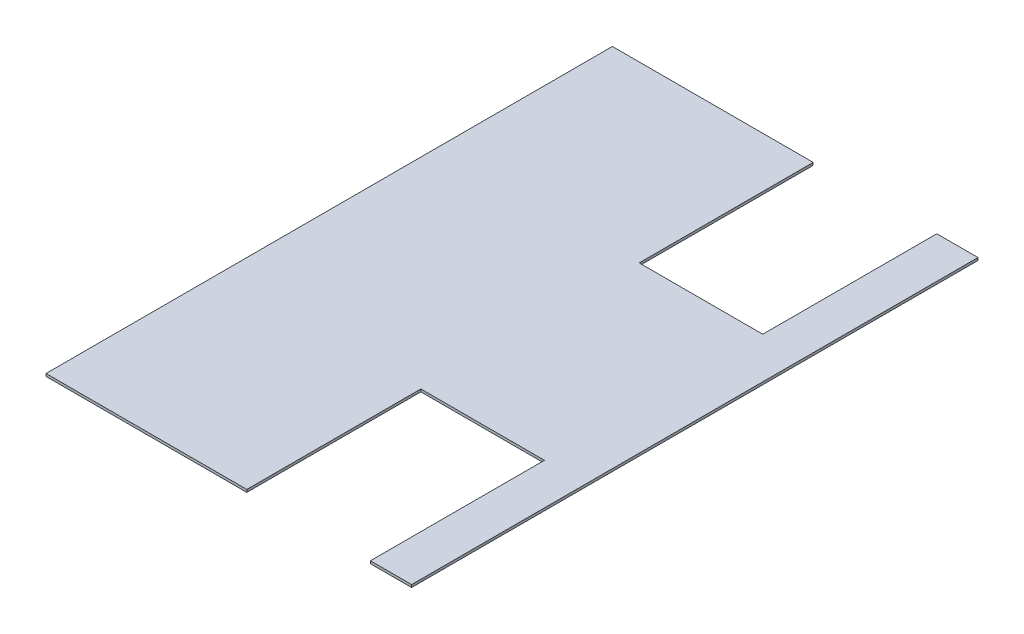
ISO-10303-21;
HEADER;
FILE_DESCRIPTION(('STEP AP214'),'2;1');
FILE_NAME('part.step','',(''),(''),'','','');
FILE_SCHEMA(('AUTOMOTIVE_DESIGN { 1 0 10303 214 1 1 1 1 }'));
ENDSEC;
DATA;
#1=APPLICATION_CONTEXT('core data for automotive mechanical design processes');
#2=APPLICATION_PROTOCOL_DEFINITION('international standard','automotive_design',2000,#1);
#3=PRODUCT_CONTEXT('',#1,'mechanical');
#4=PRODUCT('Part','Part','',(#3));
#5=PRODUCT_RELATED_PRODUCT_CATEGORY('part','',(#4));
#6=PRODUCT_DEFINITION_FORMATION('','',#4);
#7=PRODUCT_DEFINITION_CONTEXT('part definition',#1,'design');
#8=PRODUCT_DEFINITION('design','',#6,#7);
#9=PRODUCT_DEFINITION_SHAPE('','',#8);
#10=(LENGTH_UNIT() NAMED_UNIT(*) SI_UNIT(.MILLI.,.METRE.));
#11=(NAMED_UNIT(*) PLANE_ANGLE_UNIT() SI_UNIT($,.RADIAN.));
#12=(NAMED_UNIT(*) SI_UNIT($,.STERADIAN.) SOLID_ANGLE_UNIT());
#13=UNCERTAINTY_MEASURE_WITH_UNIT(LENGTH_MEASURE(1.E-05),#10,'distance_accuracy_value','');
#14=(GEOMETRIC_REPRESENTATION_CONTEXT(3) GLOBAL_UNCERTAINTY_ASSIGNED_CONTEXT((#13)) GLOBAL_UNIT_ASSIGNED_CONTEXT((#10,
#11,#12)) REPRESENTATION_CONTEXT('',''));
#15=CARTESIAN_POINT('',(0.,0.,0.));
#16=DIRECTION('',(0.,0.,1.));
#17=DIRECTION('',(1.,0.,0.));
#18=AXIS2_PLACEMENT_3D('',#15,#16,#17);
#19=CARTESIAN_POINT('',(-411.865852537314,3.175,-446.32626));
#20=DIRECTION('',(1.,0.,0.));
#21=DIRECTION('',(0.,0.,-1.));
#22=AXIS2_PLACEMENT_3D('',#19,#20,#21);
#23=PLANE('',#22);
#24=DIRECTION('',(0.,0.,1.));
#25=VECTOR('',#24,1.);
#26=CARTESIAN_POINT('',(-411.865852537314,0.,-446.32626));
#27=LINE('',#26,#25);
#28=CARTESIAN_POINT('',(-411.865852537314,0.,-446.32626));
#29=VERTEX_POINT('',#28);
#30=CARTESIAN_POINT('',(-411.865852537313,0.,252.17374));
#31=VERTEX_POINT('',#30);
#32=EDGE_CURVE('E153',#29,#31,#27,.T.);
#33=ORIENTED_EDGE('',*,*,#32,.T.);
#34=DIRECTION('',(0.,-1.,0.));
#35=VECTOR('',#34,1.);
#36=CARTESIAN_POINT('',(-411.865852537313,3.175,252.17374));
#37=LINE('',#36,#35);
#38=CARTESIAN_POINT('',(-411.865852537313,3.175,252.17374));
#39=VERTEX_POINT('',#38);
#40=EDGE_CURVE('E11',#39,#31,#37,.T.);
#41=ORIENTED_EDGE('',*,*,#40,.F.);
#42=DIRECTION('',(0.,0.,1.));
#43=VECTOR('',#42,1.);
#44=CARTESIAN_POINT('',(-411.865852537314,3.175,-446.32626));
#45=LINE('',#44,#43);
#46=CARTESIAN_POINT('',(-411.865852537314,3.175,-446.32626));
#47=VERTEX_POINT('',#46);
#48=EDGE_CURVE('E175',#47,#39,#45,.T.);
#49=ORIENTED_EDGE('',*,*,#48,.F.);
#50=DIRECTION('',(0.,-1.,0.));
#51=VECTOR('',#50,1.);
#52=CARTESIAN_POINT('',(-411.865852537314,3.175,-446.32626));
#53=LINE('',#52,#51);
#54=EDGE_CURVE('E149',#47,#29,#53,.T.);
#55=ORIENTED_EDGE('',*,*,#54,.T.);
#56=EDGE_LOOP('',(#33,#41,#49,#55));
#57=FACE_BOUND('',#56,.T.);
#58=ADVANCED_FACE('F33',(#57),#23,.F.);
#59=CARTESIAN_POINT('',(-411.865852537313,3.175,252.17374));
#60=DIRECTION('',(0.,0.,-1.));
#61=DIRECTION('',(-1.,0.,0.));
#62=AXIS2_PLACEMENT_3D('',#59,#60,#61);
#63=PLANE('',#62);
#64=DIRECTION('',(1.,0.,0.));
#65=VECTOR('',#64,1.);
#66=CARTESIAN_POINT('',(-411.865852537313,0.,252.17374));
#67=LINE('',#66,#65);
#68=CARTESIAN_POINT('',(-164.215852537313,0.,252.17374));
#69=VERTEX_POINT('',#68);
#70=EDGE_CURVE('E156',#31,#69,#67,.T.);
#71=ORIENTED_EDGE('',*,*,#70,.T.);
#72=DIRECTION('',(0.,-1.,0.));
#73=VECTOR('',#72,1.);
#74=CARTESIAN_POINT('',(-164.215852537313,3.175,252.17374));
#75=LINE('',#74,#73);
#76=CARTESIAN_POINT('',(-164.215852537313,3.175,252.17374));
#77=VERTEX_POINT('',#76);
#78=EDGE_CURVE('E41',#77,#69,#75,.T.);
#79=ORIENTED_EDGE('',*,*,#78,.F.);
#80=DIRECTION('',(1.,0.,0.));
#81=VECTOR('',#80,1.);
#82=CARTESIAN_POINT('',(-411.865852537313,3.175,252.17374));
#83=LINE('',#82,#81);
#84=EDGE_CURVE('E104',#39,#77,#83,.T.);
#85=ORIENTED_EDGE('',*,*,#84,.F.);
#86=ORIENTED_EDGE('',*,*,#40,.T.);
#87=EDGE_LOOP('',(#71,#79,#85,#86));
#88=FACE_BOUND('',#87,.T.);
#89=ADVANCED_FACE('F253',(#88),#63,.F.);
#90=CARTESIAN_POINT('',(-164.215852537313,3.175,252.17374));
#91=DIRECTION('',(-1.,0.,0.));
#92=DIRECTION('',(0.,0.,1.));
#93=AXIS2_PLACEMENT_3D('',#90,#91,#92);
#94=PLANE('',#93);
#95=DIRECTION('',(0.,0.,-1.));
#96=VECTOR('',#95,1.);
#97=CARTESIAN_POINT('',(-164.215852537313,0.,252.17374));
#98=LINE('',#97,#96);
#99=CARTESIAN_POINT('',(-164.215852537313,0.,37.54374));
#100=VERTEX_POINT('',#99);
#101=EDGE_CURVE('E158',#69,#100,#98,.T.);
#102=ORIENTED_EDGE('',*,*,#101,.T.);
#103=DIRECTION('',(0.,-1.,0.));
#104=VECTOR('',#103,1.);
#105=CARTESIAN_POINT('',(-164.215852537313,3.175,37.54374));
#106=LINE('',#105,#104);
#107=CARTESIAN_POINT('',(-164.215852537313,3.175,37.54374));
#108=VERTEX_POINT('',#107);
#109=EDGE_CURVE('E194',#108,#100,#106,.T.);
#110=ORIENTED_EDGE('',*,*,#109,.F.);
#111=DIRECTION('',(0.,0.,-1.));
#112=VECTOR('',#111,1.);
#113=CARTESIAN_POINT('',(-164.215852537313,3.175,252.17374));
#114=LINE('',#113,#112);
#115=EDGE_CURVE('E202',#77,#108,#114,.T.);
#116=ORIENTED_EDGE('',*,*,#115,.F.);
#117=ORIENTED_EDGE('',*,*,#78,.T.);
#118=EDGE_LOOP('',(#102,#110,#116,#117));
#119=FACE_BOUND('',#118,.T.);
#120=ADVANCED_FACE('F200',(#119),#94,.F.);
#121=CARTESIAN_POINT('',(-11.8158525373134,3.175,37.54374));
#122=DIRECTION('',(0.,0.,-1.));
#123=DIRECTION('',(-1.,0.,0.));
#124=AXIS2_PLACEMENT_3D('',#121,#122,#123);
#125=PLANE('',#124);
#126=DIRECTION('',(1.,0.,0.));
#127=VECTOR('',#126,1.);
#128=CARTESIAN_POINT('',(-11.8158525373134,0.,37.54374));
#129=LINE('',#128,#127);
#130=CARTESIAN_POINT('',(-11.8158525373134,0.,37.54374));
#131=VERTEX_POINT('',#130);
#132=EDGE_CURVE('E160',#100,#131,#129,.T.);
#133=ORIENTED_EDGE('',*,*,#132,.T.);
#134=DIRECTION('',(0.,-1.,0.));
#135=VECTOR('',#134,1.);
#136=CARTESIAN_POINT('',(-11.8158525373134,3.175,37.54374));
#137=LINE('',#136,#135);
#138=CARTESIAN_POINT('',(-11.8158525373134,3.175,37.54374));
#139=VERTEX_POINT('',#138);
#140=EDGE_CURVE('E191',#139,#131,#137,.T.);
#141=ORIENTED_EDGE('',*,*,#140,.F.);
#142=DIRECTION('',(1.,0.,0.));
#143=VECTOR('',#142,1.);
#144=CARTESIAN_POINT('',(-11.8158525373134,3.175,37.54374));
#145=LINE('',#144,#143);
#146=EDGE_CURVE('E220',#108,#139,#145,.T.);
#147=ORIENTED_EDGE('',*,*,#146,.F.);
#148=ORIENTED_EDGE('',*,*,#109,.T.);
#149=EDGE_LOOP('',(#133,#141,#147,#148));
#150=FACE_BOUND('',#149,.T.);
#151=ADVANCED_FACE('F211',(#150),#125,.F.);
#152=CARTESIAN_POINT('',(-11.8158525373134,3.175,252.17374));
#153=DIRECTION('',(1.,0.,0.));
#154=DIRECTION('',(0.,0.,-1.));
#155=AXIS2_PLACEMENT_3D('',#152,#153,#154);
#156=PLANE('',#155);
#157=DIRECTION('',(0.,0.,1.));
#158=VECTOR('',#157,1.);
#159=CARTESIAN_POINT('',(-11.8158525373134,0.,252.17374));
#160=LINE('',#159,#158);
#161=CARTESIAN_POINT('',(-11.8158525373134,0.,252.17374));
#162=VERTEX_POINT('',#161);
#163=EDGE_CURVE('E162',#131,#162,#160,.T.);
#164=ORIENTED_EDGE('',*,*,#163,.T.);
#165=DIRECTION('',(0.,-1.,0.));
#166=VECTOR('',#165,1.);
#167=CARTESIAN_POINT('',(-11.8158525373134,3.175,252.17374));
#168=LINE('',#167,#166);
#169=CARTESIAN_POINT('',(-11.8158525373134,3.175,252.17374));
#170=VERTEX_POINT('',#169);
#171=EDGE_CURVE('E188',#170,#162,#168,.T.);
#172=ORIENTED_EDGE('',*,*,#171,.F.);
#173=DIRECTION('',(0.,0.,1.));
#174=VECTOR('',#173,1.);
#175=CARTESIAN_POINT('',(-11.8158525373134,3.175,252.17374));
#176=LINE('',#175,#174);
#177=EDGE_CURVE('E217',#139,#170,#176,.T.);
#178=ORIENTED_EDGE('',*,*,#177,.F.);
#179=ORIENTED_EDGE('',*,*,#140,.T.);
#180=EDGE_LOOP('',(#164,#172,#178,#179));
#181=FACE_BOUND('',#180,.T.);
#182=ADVANCED_FACE('F215',(#181),#156,.F.);
#183=CARTESIAN_POINT('',(-11.8158525373134,3.175,252.17374));
#184=DIRECTION('',(0.,0.,-1.));
#185=DIRECTION('',(-1.,0.,0.));
#186=AXIS2_PLACEMENT_3D('',#183,#184,#185);
#187=PLANE('',#186);
#188=DIRECTION('',(1.,0.,0.));
#189=VECTOR('',#188,1.);
#190=CARTESIAN_POINT('',(-11.8158525373134,0.,252.17374));
#191=LINE('',#190,#189);
#192=CARTESIAN_POINT('',(38.9841474626866,0.,252.17374));
#193=VERTEX_POINT('',#192);
#194=EDGE_CURVE('E164',#162,#193,#191,.T.);
#195=ORIENTED_EDGE('',*,*,#194,.T.);
#196=DIRECTION('',(0.,-1.,0.));
#197=VECTOR('',#196,1.);
#198=CARTESIAN_POINT('',(38.9841474626866,3.175,252.17374));
#199=LINE('',#198,#197);
#200=CARTESIAN_POINT('',(38.9841474626866,3.175,252.17374));
#201=VERTEX_POINT('',#200);
#202=EDGE_CURVE('E185',#201,#193,#199,.T.);
#203=ORIENTED_EDGE('',*,*,#202,.F.);
#204=DIRECTION('',(1.,0.,0.));
#205=VECTOR('',#204,1.);
#206=CARTESIAN_POINT('',(-11.8158525373134,3.175,252.17374));
#207=LINE('',#206,#205);
#208=EDGE_CURVE('E219',#170,#201,#207,.T.);
#209=ORIENTED_EDGE('',*,*,#208,.F.);
#210=ORIENTED_EDGE('',*,*,#171,.T.);
#211=EDGE_LOOP('',(#195,#203,#209,#210));
#212=FACE_BOUND('',#211,.T.);
#213=ADVANCED_FACE('F266',(#212),#187,.F.);
#214=CARTESIAN_POINT('',(38.9841474626865,3.175,-446.32626));
#215=DIRECTION('',(-1.,0.,0.));
#216=DIRECTION('',(0.,0.,1.));
#217=AXIS2_PLACEMENT_3D('',#214,#215,#216);
#218=PLANE('',#217);
#219=DIRECTION('',(0.,0.,-1.));
#220=VECTOR('',#219,1.);
#221=CARTESIAN_POINT('',(38.9841474626865,0.,-446.32626));
#222=LINE('',#221,#220);
#223=CARTESIAN_POINT('',(38.9841474626865,0.,-446.32626));
#224=VERTEX_POINT('',#223);
#225=EDGE_CURVE('E166',#193,#224,#222,.T.);
#226=ORIENTED_EDGE('',*,*,#225,.T.);
#227=DIRECTION('',(0.,-1.,0.));
#228=VECTOR('',#227,1.);
#229=CARTESIAN_POINT('',(38.9841474626865,3.175,-446.32626));
#230=LINE('',#229,#228);
#231=CARTESIAN_POINT('',(38.9841474626865,3.175,-446.32626));
#232=VERTEX_POINT('',#231);
#233=EDGE_CURVE('E182',#232,#224,#230,.T.);
#234=ORIENTED_EDGE('',*,*,#233,.F.);
#235=DIRECTION('',(0.,0.,-1.));
#236=VECTOR('',#235,1.);
#237=CARTESIAN_POINT('',(38.9841474626865,3.175,-446.32626));
#238=LINE('',#237,#236);
#239=EDGE_CURVE('E222',#201,#232,#238,.T.);
#240=ORIENTED_EDGE('',*,*,#239,.F.);
#241=ORIENTED_EDGE('',*,*,#202,.T.);
#242=EDGE_LOOP('',(#226,#234,#240,#241));
#243=FACE_BOUND('',#242,.T.);
#244=ADVANCED_FACE('F269',(#243),#218,.F.);
#245=CARTESIAN_POINT('',(-11.8158525373136,3.175,-446.32626));
#246=DIRECTION('',(0.,0.,1.));
#247=DIRECTION('',(1.,0.,0.));
#248=AXIS2_PLACEMENT_3D('',#245,#246,#247);
#249=PLANE('',#248);
#250=DIRECTION('',(-1.,0.,0.));
#251=VECTOR('',#250,1.);
#252=CARTESIAN_POINT('',(-11.8158525373136,0.,-446.32626));
#253=LINE('',#252,#251);
#254=CARTESIAN_POINT('',(-11.8158525373136,0.,-446.32626));
#255=VERTEX_POINT('',#254);
#256=EDGE_CURVE('E168',#224,#255,#253,.T.);
#257=ORIENTED_EDGE('',*,*,#256,.T.);
#258=DIRECTION('',(0.,-1.,0.));
#259=VECTOR('',#258,1.);
#260=CARTESIAN_POINT('',(-11.8158525373136,3.175,-446.32626));
#261=LINE('',#260,#259);
#262=CARTESIAN_POINT('',(-11.8158525373136,3.175,-446.32626));
#263=VERTEX_POINT('',#262);
#264=EDGE_CURVE('E179',#263,#255,#261,.T.);
#265=ORIENTED_EDGE('',*,*,#264,.F.);
#266=DIRECTION('',(-1.,0.,0.));
#267=VECTOR('',#266,1.);
#268=CARTESIAN_POINT('',(-11.8158525373136,3.175,-446.32626));
#269=LINE('',#268,#267);
#270=EDGE_CURVE('E228',#232,#263,#269,.T.);
#271=ORIENTED_EDGE('',*,*,#270,.F.);
#272=ORIENTED_EDGE('',*,*,#233,.T.);
#273=EDGE_LOOP('',(#257,#265,#271,#272));
#274=FACE_BOUND('',#273,.T.);
#275=ADVANCED_FACE('F234',(#274),#249,.F.);
#276=CARTESIAN_POINT('',(-11.8158525373136,3.175,-446.32626));
#277=DIRECTION('',(1.,0.,0.));
#278=DIRECTION('',(0.,0.,-1.));
#279=AXIS2_PLACEMENT_3D('',#276,#277,#278);
#280=PLANE('',#279);
#281=DIRECTION('',(0.,0.,1.));
#282=VECTOR('',#281,1.);
#283=CARTESIAN_POINT('',(-11.8158525373136,0.,-446.32626));
#284=LINE('',#283,#282);
#285=CARTESIAN_POINT('',(-11.8158525373135,0.,-231.69626));
#286=VERTEX_POINT('',#285);
#287=EDGE_CURVE('E170',#255,#286,#284,.T.);
#288=ORIENTED_EDGE('',*,*,#287,.T.);
#289=DIRECTION('',(0.,-1.,0.));
#290=VECTOR('',#289,1.);
#291=CARTESIAN_POINT('',(-11.8158525373135,3.175,-231.69626));
#292=LINE('',#291,#290);
#293=CARTESIAN_POINT('',(-11.8158525373135,3.175,-231.69626));
#294=VERTEX_POINT('',#293);
#295=EDGE_CURVE('E144',#294,#286,#292,.T.);
#296=ORIENTED_EDGE('',*,*,#295,.F.);
#297=DIRECTION('',(0.,0.,1.));
#298=VECTOR('',#297,1.);
#299=CARTESIAN_POINT('',(-11.8158525373136,3.175,-446.32626));
#300=LINE('',#299,#298);
#301=EDGE_CURVE('E135',#263,#294,#300,.T.);
#302=ORIENTED_EDGE('',*,*,#301,.F.);
#303=ORIENTED_EDGE('',*,*,#264,.T.);
#304=EDGE_LOOP('',(#288,#296,#302,#303));
#305=FACE_BOUND('',#304,.T.);
#306=ADVANCED_FACE('F238',(#305),#280,.F.);
#307=CARTESIAN_POINT('',(-11.8158525373135,3.175,-231.69626));
#308=DIRECTION('',(0.,0.,1.));
#309=DIRECTION('',(1.,0.,0.));
#310=AXIS2_PLACEMENT_3D('',#307,#308,#309);
#311=PLANE('',#310);
#312=DIRECTION('',(-1.,0.,0.));
#313=VECTOR('',#312,1.);
#314=CARTESIAN_POINT('',(-11.8158525373135,0.,-231.69626));
#315=LINE('',#314,#313);
#316=CARTESIAN_POINT('',(-164.215852537314,0.,-231.69626));
#317=VERTEX_POINT('',#316);
#318=EDGE_CURVE('E143',#286,#317,#315,.T.);
#319=ORIENTED_EDGE('',*,*,#318,.T.);
#320=DIRECTION('',(0.,-1.,0.));
#321=VECTOR('',#320,1.);
#322=CARTESIAN_POINT('',(-164.215852537314,3.175,-231.69626));
#323=LINE('',#322,#321);
#324=CARTESIAN_POINT('',(-164.215852537314,3.175,-231.69626));
#325=VERTEX_POINT('',#324);
#326=EDGE_CURVE('E140',#325,#317,#323,.T.);
#327=ORIENTED_EDGE('',*,*,#326,.F.);
#328=DIRECTION('',(-1.,0.,0.));
#329=VECTOR('',#328,1.);
#330=CARTESIAN_POINT('',(-11.8158525373135,3.175,-231.69626));
#331=LINE('',#330,#329);
#332=EDGE_CURVE('E129',#294,#325,#331,.T.);
#333=ORIENTED_EDGE('',*,*,#332,.F.);
#334=ORIENTED_EDGE('',*,*,#295,.T.);
#335=EDGE_LOOP('',(#319,#327,#333,#334));
#336=FACE_BOUND('',#335,.T.);
#337=ADVANCED_FACE('F141',(#336),#311,.F.);
#338=CARTESIAN_POINT('',(-164.215852537314,3.175,-446.32626));
#339=DIRECTION('',(-1.,0.,0.));
#340=DIRECTION('',(0.,0.,1.));
#341=AXIS2_PLACEMENT_3D('',#338,#339,#340);
#342=PLANE('',#341);
#343=DIRECTION('',(0.,0.,-1.));
#344=VECTOR('',#343,1.);
#345=CARTESIAN_POINT('',(-164.215852537314,0.,-446.32626));
#346=LINE('',#345,#344);
#347=CARTESIAN_POINT('',(-164.215852537314,0.,-446.32626));
#348=VERTEX_POINT('',#347);
#349=EDGE_CURVE('E90',#317,#348,#346,.T.);
#350=ORIENTED_EDGE('',*,*,#349,.T.);
#351=DIRECTION('',(0.,-1.,0.));
#352=VECTOR('',#351,1.);
#353=CARTESIAN_POINT('',(-164.215852537314,3.175,-446.32626));
#354=LINE('',#353,#352);
#355=CARTESIAN_POINT('',(-164.215852537314,3.175,-446.32626));
#356=VERTEX_POINT('',#355);
#357=EDGE_CURVE('E145',#356,#348,#354,.T.);
#358=ORIENTED_EDGE('',*,*,#357,.F.);
#359=DIRECTION('',(0.,0.,-1.));
#360=VECTOR('',#359,1.);
#361=CARTESIAN_POINT('',(-164.215852537314,3.175,-446.32626));
#362=LINE('',#361,#360);
#363=EDGE_CURVE('E133',#325,#356,#362,.T.);
#364=ORIENTED_EDGE('',*,*,#363,.F.);
#365=ORIENTED_EDGE('',*,*,#326,.T.);
#366=EDGE_LOOP('',(#350,#358,#364,#365));
#367=FACE_BOUND('',#366,.T.);
#368=ADVANCED_FACE('F147',(#367),#342,.F.);
#369=CARTESIAN_POINT('',(-411.865852537314,3.175,-446.32626));
#370=DIRECTION('',(0.,0.,1.));
#371=DIRECTION('',(1.,0.,0.));
#372=AXIS2_PLACEMENT_3D('',#369,#370,#371);
#373=PLANE('',#372);
#374=DIRECTION('',(-1.,0.,0.));
#375=VECTOR('',#374,1.);
#376=CARTESIAN_POINT('',(-411.865852537314,0.,-446.32626));
#377=LINE('',#376,#375);
#378=EDGE_CURVE('E96',#348,#29,#377,.T.);
#379=ORIENTED_EDGE('',*,*,#378,.T.);
#380=ORIENTED_EDGE('',*,*,#54,.F.);
#381=DIRECTION('',(-1.,0.,0.));
#382=VECTOR('',#381,1.);
#383=CARTESIAN_POINT('',(-411.865852537314,3.175,-446.32626));
#384=LINE('',#383,#382);
#385=EDGE_CURVE('E49',#356,#47,#384,.T.);
#386=ORIENTED_EDGE('',*,*,#385,.F.);
#387=ORIENTED_EDGE('',*,*,#357,.T.);
#388=EDGE_LOOP('',(#379,#380,#386,#387));
#389=FACE_BOUND('',#388,.T.);
#390=ADVANCED_FACE('F242',(#389),#373,.F.);
#391=CARTESIAN_POINT('',(0.,3.175,0.));
#392=DIRECTION('',(0.,1.,0.));
#393=DIRECTION('',(0.,0.,1.));
#394=AXIS2_PLACEMENT_3D('',#391,#392,#393);
#395=PLANE('',#394);
#396=ORIENTED_EDGE('',*,*,#48,.T.);
#397=ORIENTED_EDGE('',*,*,#84,.T.);
#398=ORIENTED_EDGE('',*,*,#115,.T.);
#399=ORIENTED_EDGE('',*,*,#146,.T.);
#400=ORIENTED_EDGE('',*,*,#177,.T.);
#401=ORIENTED_EDGE('',*,*,#208,.T.);
#402=ORIENTED_EDGE('',*,*,#239,.T.);
#403=ORIENTED_EDGE('',*,*,#270,.T.);
#404=ORIENTED_EDGE('',*,*,#301,.T.);
#405=ORIENTED_EDGE('',*,*,#332,.T.);
#406=ORIENTED_EDGE('',*,*,#363,.T.);
#407=ORIENTED_EDGE('',*,*,#385,.T.);
#408=EDGE_LOOP('',(#396,#397,#398,#399,#400,#401,#402,#403,#404,#405,#406,#407));
#409=FACE_BOUND('',#408,.T.);
#410=ADVANCED_FACE('F131',(#409),#395,.T.);
#411=CARTESIAN_POINT('',(0.,0.,0.));
#412=DIRECTION('',(0.,1.,0.));
#413=DIRECTION('',(0.,0.,1.));
#414=AXIS2_PLACEMENT_3D('',#411,#412,#413);
#415=PLANE('',#414);
#416=ORIENTED_EDGE('',*,*,#32,.F.);
#417=ORIENTED_EDGE('',*,*,#378,.F.);
#418=ORIENTED_EDGE('',*,*,#349,.F.);
#419=ORIENTED_EDGE('',*,*,#318,.F.);
#420=ORIENTED_EDGE('',*,*,#287,.F.);
#421=ORIENTED_EDGE('',*,*,#256,.F.);
#422=ORIENTED_EDGE('',*,*,#225,.F.);
#423=ORIENTED_EDGE('',*,*,#194,.F.);
#424=ORIENTED_EDGE('',*,*,#163,.F.);
#425=ORIENTED_EDGE('',*,*,#132,.F.);
#426=ORIENTED_EDGE('',*,*,#101,.F.);
#427=ORIENTED_EDGE('',*,*,#70,.F.);
#428=EDGE_LOOP('',(#416,#417,#418,#419,#420,#421,#422,#423,#424,#425,#426,#427));
#429=FACE_BOUND('',#428,.T.);
#430=ADVANCED_FACE('F206',(#429),#415,.F.);
#431=CLOSED_SHELL('',(#58,#89,#120,#151,#182,#213,#244,#275,#306,#337,#368,#390,#410,#430));
#432=MANIFOLD_SOLID_BREP('B2',#431);
#433=ADVANCED_BREP_SHAPE_REPRESENTATION('',(#18,#432),#14);
#434=SHAPE_DEFINITION_REPRESENTATION(#9,#433);
ENDSEC;
END-ISO-10303-21;
